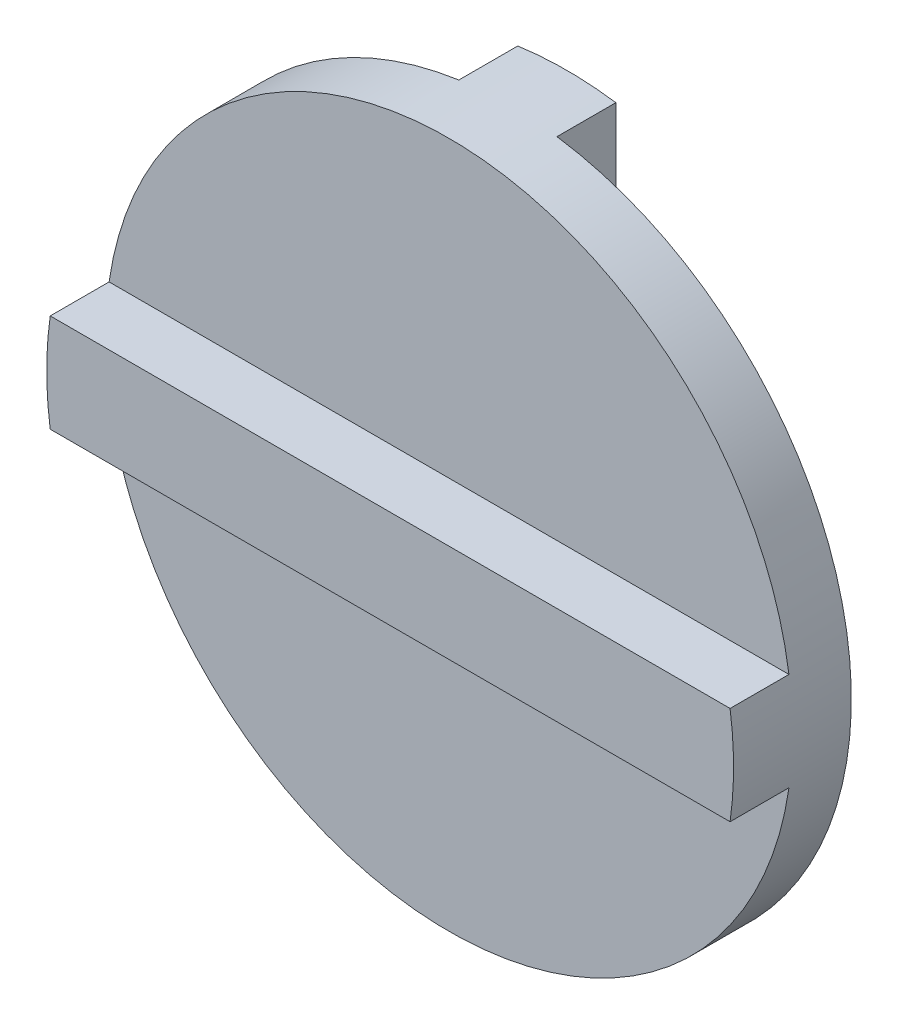
ISO-10303-21;
HEADER;
FILE_DESCRIPTION(('STEP AP214'),'2;1');
FILE_NAME('part.step','',(''),(''),'','','');
FILE_SCHEMA(('AUTOMOTIVE_DESIGN { 1 0 10303 214 1 1 1 1 }'));
ENDSEC;
DATA;
#1=APPLICATION_CONTEXT('core data for automotive mechanical design processes');
#2=APPLICATION_PROTOCOL_DEFINITION('international standard','automotive_design',2000,#1);
#3=PRODUCT_CONTEXT('',#1,'mechanical');
#4=PRODUCT('Part','Part','',(#3));
#5=PRODUCT_RELATED_PRODUCT_CATEGORY('part','',(#4));
#6=PRODUCT_DEFINITION_FORMATION('','',#4);
#7=PRODUCT_DEFINITION_CONTEXT('part definition',#1,'design');
#8=PRODUCT_DEFINITION('design','',#6,#7);
#9=PRODUCT_DEFINITION_SHAPE('','',#8);
#10=(LENGTH_UNIT() NAMED_UNIT(*) SI_UNIT(.MILLI.,.METRE.));
#11=(NAMED_UNIT(*) PLANE_ANGLE_UNIT() SI_UNIT($,.RADIAN.));
#12=(NAMED_UNIT(*) SI_UNIT($,.STERADIAN.) SOLID_ANGLE_UNIT());
#13=UNCERTAINTY_MEASURE_WITH_UNIT(LENGTH_MEASURE(1.E-05),#10,'distance_accuracy_value','');
#14=(GEOMETRIC_REPRESENTATION_CONTEXT(3) GLOBAL_UNCERTAINTY_ASSIGNED_CONTEXT((#13)) GLOBAL_UNIT_ASSIGNED_CONTEXT((#10,
#11,#12)) REPRESENTATION_CONTEXT('',''));
#15=CARTESIAN_POINT('',(0.,0.,0.));
#16=DIRECTION('',(0.,0.,1.));
#17=DIRECTION('',(1.,0.,0.));
#18=AXIS2_PLACEMENT_3D('',#15,#16,#17);
#19=CARTESIAN_POINT('',(0.,0.,-1.05));
#20=DIRECTION('',(0.,0.,1.));
#21=DIRECTION('',(1.,0.,0.));
#22=AXIS2_PLACEMENT_3D('',#19,#20,#21);
#23=PLANE('',#22);
#24=DIRECTION('',(0.,1.,0.));
#25=VECTOR('',#24,1.);
#26=CARTESIAN_POINT('',(-1.75,-12.1243556529821,-1.05));
#27=LINE('',#26,#25);
#28=CARTESIAN_POINT('',(-1.75,-12.1243556529821,-1.05));
#29=VERTEX_POINT('',#28);
#30=CARTESIAN_POINT('',(-1.75,12.1243556529821,-1.05));
#31=VERTEX_POINT('',#30);
#32=EDGE_CURVE('E48',#29,#31,#27,.T.);
#33=ORIENTED_EDGE('',*,*,#32,.F.);
#34=CARTESIAN_POINT('',(0.,0.,-1.05));
#35=DIRECTION('',(0.,0.,1.));
#36=DIRECTION('',(1.,0.,0.));
#37=AXIS2_PLACEMENT_3D('',#34,#35,#36);
#38=CIRCLE('',#37,12.25);
#39=EDGE_CURVE('E51',#31,#29,#38,.T.);
#40=ORIENTED_EDGE('',*,*,#39,.F.);
#41=EDGE_LOOP('',(#33,#40));
#42=FACE_BOUND('',#41,.T.);
#43=ADVANCED_FACE('F33',(#42),#23,.F.);
#44=DIRECTION('',(0.,-1.,0.));
#45=VECTOR('',#44,1.);
#46=CARTESIAN_POINT('',(1.75,-12.1243556529821,-1.05));
#47=LINE('',#46,#45);
#48=CARTESIAN_POINT('',(1.75,12.1243556529821,-1.05));
#49=VERTEX_POINT('',#48);
#50=CARTESIAN_POINT('',(1.75000000000001,-12.1243556529821,-1.05));
#51=VERTEX_POINT('',#50);
#52=EDGE_CURVE('E186',#49,#51,#47,.T.);
#53=ORIENTED_EDGE('',*,*,#52,.F.);
#54=EDGE_CURVE('E37',#51,#49,#38,.T.);
#55=ORIENTED_EDGE('',*,*,#54,.F.);
#56=EDGE_LOOP('',(#53,#55));
#57=FACE_BOUND('',#56,.T.);
#58=ADVANCED_FACE('F178',(#57),#23,.F.);
#59=CARTESIAN_POINT('',(0.,0.,1.05));
#60=DIRECTION('',(0.,0.,1.));
#61=DIRECTION('',(1.,0.,0.));
#62=AXIS2_PLACEMENT_3D('',#59,#60,#61);
#63=PLANE('',#62);
#64=DIRECTION('',(1.,0.,0.));
#65=VECTOR('',#64,1.);
#66=CARTESIAN_POINT('',(-12.1243556529821,-1.75,1.05));
#67=LINE('',#66,#65);
#68=CARTESIAN_POINT('',(-12.1243556529821,-1.75,1.05));
#69=VERTEX_POINT('',#68);
#70=CARTESIAN_POINT('',(12.1243556529821,-1.75,1.05));
#71=VERTEX_POINT('',#70);
#72=EDGE_CURVE('E120',#69,#71,#67,.T.);
#73=ORIENTED_EDGE('',*,*,#72,.F.);
#74=CARTESIAN_POINT('',(0.,0.,1.05));
#75=DIRECTION('',(0.,0.,1.));
#76=DIRECTION('',(1.,0.,0.));
#77=AXIS2_PLACEMENT_3D('',#74,#75,#76);
#78=CIRCLE('',#77,12.25);
#79=EDGE_CURVE('E42',#69,#71,#78,.T.);
#80=ORIENTED_EDGE('',*,*,#79,.T.);
#81=EDGE_LOOP('',(#73,#80));
#82=FACE_BOUND('',#81,.T.);
#83=ADVANCED_FACE('F154',(#82),#63,.T.);
#84=CARTESIAN_POINT('',(0.,0.,1.05));
#85=DIRECTION('',(0.,0.,-1.));
#86=DIRECTION('',(-1.,0.,0.));
#87=AXIS2_PLACEMENT_3D('',#84,#85,#86);
#88=CYLINDRICAL_SURFACE('',#87,12.25);
#89=CARTESIAN_POINT('',(12.1243556529821,1.75,1.05));
#90=VERTEX_POINT('',#89);
#91=CARTESIAN_POINT('',(-12.1243556529821,1.75,1.05));
#92=VERTEX_POINT('',#91);
#93=EDGE_CURVE('E11',#90,#92,#78,.T.);
#94=ORIENTED_EDGE('',*,*,#93,.F.);
#95=DIRECTION('',(0.,0.,-1.));
#96=VECTOR('',#95,1.);
#97=CARTESIAN_POINT('',(12.1243556529821,1.75,3.15));
#98=LINE('',#97,#96);
#99=CARTESIAN_POINT('',(12.1243556529821,1.75,3.15));
#100=VERTEX_POINT('',#99);
#101=EDGE_CURVE('E146',#100,#90,#98,.T.);
#102=ORIENTED_EDGE('',*,*,#101,.F.);
#103=CARTESIAN_POINT('',(0.,0.,3.15));
#104=DIRECTION('',(0.,0.,1.));
#105=DIRECTION('',(1.,0.,0.));
#106=AXIS2_PLACEMENT_3D('',#103,#104,#105);
#107=CIRCLE('',#106,12.25);
#108=CARTESIAN_POINT('',(12.1243556529821,-1.75,3.15));
#109=VERTEX_POINT('',#108);
#110=EDGE_CURVE('E126',#109,#100,#107,.T.);
#111=ORIENTED_EDGE('',*,*,#110,.F.);
#112=DIRECTION('',(0.,0.,-1.));
#113=VECTOR('',#112,1.);
#114=CARTESIAN_POINT('',(12.1243556529821,-1.75,3.15));
#115=LINE('',#114,#113);
#116=EDGE_CURVE('E134',#109,#71,#115,.T.);
#117=ORIENTED_EDGE('',*,*,#116,.T.);
#118=ORIENTED_EDGE('',*,*,#79,.F.);
#119=DIRECTION('',(0.,0.,-1.));
#120=VECTOR('',#119,1.);
#121=CARTESIAN_POINT('',(-12.1243556529821,-1.75,3.15));
#122=LINE('',#121,#120);
#123=CARTESIAN_POINT('',(-12.1243556529821,-1.75,3.15));
#124=VERTEX_POINT('',#123);
#125=EDGE_CURVE('E140',#124,#69,#122,.T.);
#126=ORIENTED_EDGE('',*,*,#125,.F.);
#127=CARTESIAN_POINT('',(0.,0.,3.15));
#128=DIRECTION('',(0.,0.,1.));
#129=DIRECTION('',(1.,0.,0.));
#130=AXIS2_PLACEMENT_3D('',#127,#128,#129);
#131=CIRCLE('',#130,12.25);
#132=CARTESIAN_POINT('',(-12.1243556529821,1.75,3.15));
#133=VERTEX_POINT('',#132);
#134=EDGE_CURVE('E131',#133,#124,#131,.T.);
#135=ORIENTED_EDGE('',*,*,#134,.F.);
#136=DIRECTION('',(0.,0.,-1.));
#137=VECTOR('',#136,1.);
#138=CARTESIAN_POINT('',(-12.1243556529821,1.75,3.15));
#139=LINE('',#138,#137);
#140=EDGE_CURVE('E143',#133,#92,#139,.T.);
#141=ORIENTED_EDGE('',*,*,#140,.T.);
#142=EDGE_LOOP('',(#94,#102,#111,#117,#118,#126,#135,#141));
#143=FACE_BOUND('',#142,.T.);
#144=ORIENTED_EDGE('',*,*,#54,.T.);
#145=DIRECTION('',(0.,0.,1.));
#146=VECTOR('',#145,1.);
#147=CARTESIAN_POINT('',(1.75,12.1243556529821,-3.15));
#148=LINE('',#147,#146);
#149=CARTESIAN_POINT('',(1.75,12.1243556529821,-3.15));
#150=VERTEX_POINT('',#149);
#151=EDGE_CURVE('E100',#150,#49,#148,.T.);
#152=ORIENTED_EDGE('',*,*,#151,.F.);
#153=CARTESIAN_POINT('',(0.,0.,-3.15));
#154=DIRECTION('',(0.,0.,-1.));
#155=DIRECTION('',(-1.,0.,0.));
#156=AXIS2_PLACEMENT_3D('',#153,#154,#155);
#157=CIRCLE('',#156,12.25);
#158=CARTESIAN_POINT('',(-1.75,12.1243556529821,-3.15));
#159=VERTEX_POINT('',#158);
#160=EDGE_CURVE('E106',#159,#150,#157,.T.);
#161=ORIENTED_EDGE('',*,*,#160,.F.);
#162=DIRECTION('',(0.,0.,1.));
#163=VECTOR('',#162,1.);
#164=CARTESIAN_POINT('',(-1.75,12.1243556529821,-3.15));
#165=LINE('',#164,#163);
#166=EDGE_CURVE('E192',#159,#31,#165,.T.);
#167=ORIENTED_EDGE('',*,*,#166,.T.);
#168=ORIENTED_EDGE('',*,*,#39,.T.);
#169=DIRECTION('',(0.,0.,1.));
#170=VECTOR('',#169,1.);
#171=CARTESIAN_POINT('',(-1.75,-12.1243556529821,-3.15));
#172=LINE('',#171,#170);
#173=CARTESIAN_POINT('',(-1.75,-12.1243556529821,-3.15));
#174=VERTEX_POINT('',#173);
#175=EDGE_CURVE('E122',#174,#29,#172,.T.);
#176=ORIENTED_EDGE('',*,*,#175,.F.);
#177=CARTESIAN_POINT('',(0.,0.,-3.15));
#178=DIRECTION('',(0.,0.,-1.));
#179=DIRECTION('',(-1.,0.,0.));
#180=AXIS2_PLACEMENT_3D('',#177,#178,#179);
#181=CIRCLE('',#180,12.25);
#182=CARTESIAN_POINT('',(1.75000000000001,-12.1243556529821,-3.15));
#183=VERTEX_POINT('',#182);
#184=EDGE_CURVE('E105',#183,#174,#181,.T.);
#185=ORIENTED_EDGE('',*,*,#184,.F.);
#186=DIRECTION('',(0.,0.,1.));
#187=VECTOR('',#186,1.);
#188=CARTESIAN_POINT('',(1.75000000000001,-12.1243556529821,-3.15));
#189=LINE('',#188,#187);
#190=EDGE_CURVE('E102',#183,#51,#189,.T.);
#191=ORIENTED_EDGE('',*,*,#190,.T.);
#192=EDGE_LOOP('',(#144,#152,#161,#167,#168,#176,#185,#191));
#193=FACE_BOUND('',#192,.T.);
#194=ADVANCED_FACE('F35',(#143,#193),#88,.T.);
#195=DIRECTION('',(-1.,0.,0.));
#196=VECTOR('',#195,1.);
#197=CARTESIAN_POINT('',(-12.1243556529821,1.75,1.05));
#198=LINE('',#197,#196);
#199=EDGE_CURVE('E117',#90,#92,#198,.T.);
#200=ORIENTED_EDGE('',*,*,#199,.F.);
#201=ORIENTED_EDGE('',*,*,#93,.T.);
#202=EDGE_LOOP('',(#200,#201));
#203=FACE_BOUND('',#202,.T.);
#204=ADVANCED_FACE('F169',(#203),#63,.T.);
#205=CARTESIAN_POINT('',(-12.1243556529821,1.75,3.15));
#206=DIRECTION('',(0.,-1.,0.));
#207=DIRECTION('',(0.,0.,-1.));
#208=AXIS2_PLACEMENT_3D('',#205,#206,#207);
#209=PLANE('',#208);
#210=ORIENTED_EDGE('',*,*,#199,.T.);
#211=ORIENTED_EDGE('',*,*,#140,.F.);
#212=DIRECTION('',(-1.,0.,0.));
#213=VECTOR('',#212,1.);
#214=CARTESIAN_POINT('',(-12.1243556529821,1.75,3.15));
#215=LINE('',#214,#213);
#216=EDGE_CURVE('E129',#100,#133,#215,.T.);
#217=ORIENTED_EDGE('',*,*,#216,.F.);
#218=ORIENTED_EDGE('',*,*,#101,.T.);
#219=EDGE_LOOP('',(#210,#211,#217,#218));
#220=FACE_BOUND('',#219,.T.);
#221=ADVANCED_FACE('F167',(#220),#209,.F.);
#222=CARTESIAN_POINT('',(-12.1243556529821,-1.75,3.15));
#223=DIRECTION('',(0.,1.,0.));
#224=DIRECTION('',(0.,0.,1.));
#225=AXIS2_PLACEMENT_3D('',#222,#223,#224);
#226=PLANE('',#225);
#227=ORIENTED_EDGE('',*,*,#72,.T.);
#228=ORIENTED_EDGE('',*,*,#116,.F.);
#229=DIRECTION('',(1.,0.,0.));
#230=VECTOR('',#229,1.);
#231=CARTESIAN_POINT('',(-12.1243556529821,-1.75,3.15));
#232=LINE('',#231,#230);
#233=EDGE_CURVE('E133',#124,#109,#232,.T.);
#234=ORIENTED_EDGE('',*,*,#233,.F.);
#235=ORIENTED_EDGE('',*,*,#125,.T.);
#236=EDGE_LOOP('',(#227,#228,#234,#235));
#237=FACE_BOUND('',#236,.T.);
#238=ADVANCED_FACE('F159',(#237),#226,.F.);
#239=CARTESIAN_POINT('',(0.,0.,3.15));
#240=DIRECTION('',(0.,0.,1.));
#241=DIRECTION('',(1.,0.,0.));
#242=AXIS2_PLACEMENT_3D('',#239,#240,#241);
#243=PLANE('',#242);
#244=ORIENTED_EDGE('',*,*,#110,.T.);
#245=ORIENTED_EDGE('',*,*,#216,.T.);
#246=ORIENTED_EDGE('',*,*,#134,.T.);
#247=ORIENTED_EDGE('',*,*,#233,.T.);
#248=EDGE_LOOP('',(#244,#245,#246,#247));
#249=FACE_BOUND('',#248,.T.);
#250=ADVANCED_FACE('F164',(#249),#243,.T.);
#251=CARTESIAN_POINT('',(1.75,-12.1243556529821,-3.15));
#252=DIRECTION('',(-1.,0.,0.));
#253=DIRECTION('',(0.,0.,1.));
#254=AXIS2_PLACEMENT_3D('',#251,#252,#253);
#255=PLANE('',#254);
#256=ORIENTED_EDGE('',*,*,#52,.T.);
#257=ORIENTED_EDGE('',*,*,#190,.F.);
#258=DIRECTION('',(0.,-1.,0.));
#259=VECTOR('',#258,1.);
#260=CARTESIAN_POINT('',(1.75,-12.1243556529821,-3.15));
#261=LINE('',#260,#259);
#262=EDGE_CURVE('E95',#150,#183,#261,.T.);
#263=ORIENTED_EDGE('',*,*,#262,.F.);
#264=ORIENTED_EDGE('',*,*,#151,.T.);
#265=EDGE_LOOP('',(#256,#257,#263,#264));
#266=FACE_BOUND('',#265,.T.);
#267=ADVANCED_FACE('F98',(#266),#255,.F.);
#268=CARTESIAN_POINT('',(-1.75,-12.1243556529821,-3.15));
#269=DIRECTION('',(1.,0.,0.));
#270=DIRECTION('',(0.,0.,-1.));
#271=AXIS2_PLACEMENT_3D('',#268,#269,#270);
#272=PLANE('',#271);
#273=ORIENTED_EDGE('',*,*,#32,.T.);
#274=ORIENTED_EDGE('',*,*,#166,.F.);
#275=DIRECTION('',(0.,1.,0.));
#276=VECTOR('',#275,1.);
#277=CARTESIAN_POINT('',(-1.75,-12.1243556529821,-3.15));
#278=LINE('',#277,#276);
#279=EDGE_CURVE('E111',#174,#159,#278,.T.);
#280=ORIENTED_EDGE('',*,*,#279,.F.);
#281=ORIENTED_EDGE('',*,*,#175,.T.);
#282=EDGE_LOOP('',(#273,#274,#280,#281));
#283=FACE_BOUND('',#282,.T.);
#284=ADVANCED_FACE('F194',(#283),#272,.F.);
#285=CARTESIAN_POINT('',(0.,0.,-3.15));
#286=DIRECTION('',(0.,0.,-1.));
#287=DIRECTION('',(-1.,0.,0.));
#288=AXIS2_PLACEMENT_3D('',#285,#286,#287);
#289=PLANE('',#288);
#290=ORIENTED_EDGE('',*,*,#160,.T.);
#291=ORIENTED_EDGE('',*,*,#262,.T.);
#292=ORIENTED_EDGE('',*,*,#184,.T.);
#293=ORIENTED_EDGE('',*,*,#279,.T.);
#294=EDGE_LOOP('',(#290,#291,#292,#293));
#295=FACE_BOUND('',#294,.T.);
#296=ADVANCED_FACE('F109',(#295),#289,.T.);
#297=CLOSED_SHELL('',(#43,#58,#83,#194,#204,#221,#238,#250,#267,#284,#296));
#298=MANIFOLD_SOLID_BREP('B2',#297);
#299=ADVANCED_BREP_SHAPE_REPRESENTATION('',(#18,#298),#14);
#300=SHAPE_DEFINITION_REPRESENTATION(#9,#299);
ENDSEC;
END-ISO-10303-21;
